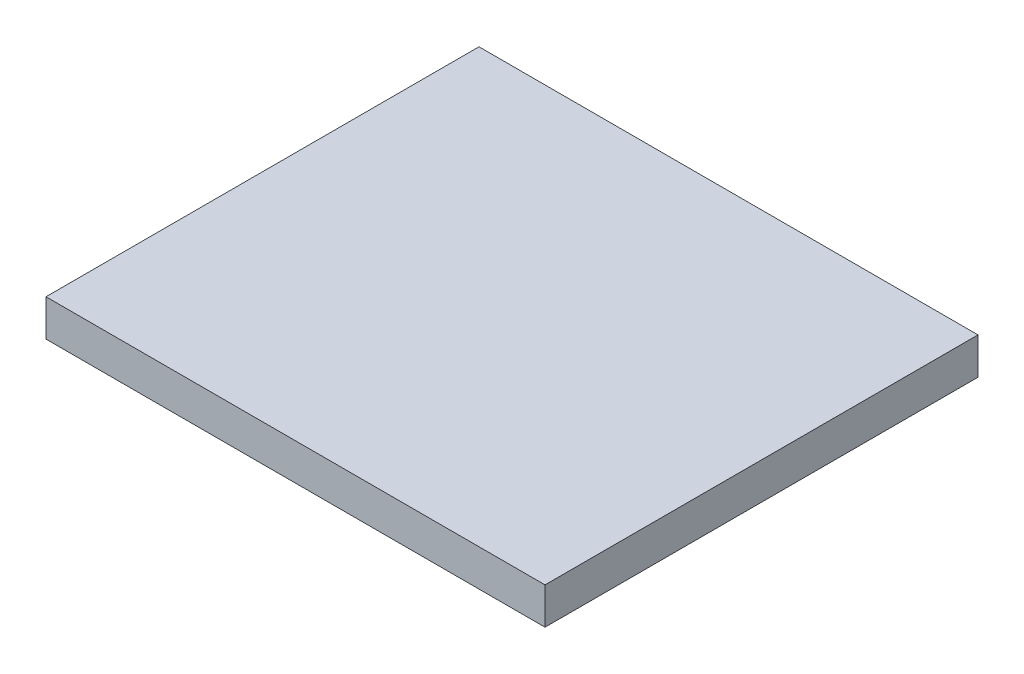
ISO-10303-21;
HEADER;
FILE_DESCRIPTION(('STEP AP214'),'2;1');
FILE_NAME('part.step','',(''),(''),'','','');
FILE_SCHEMA(('AUTOMOTIVE_DESIGN { 1 0 10303 214 1 1 1 1 }'));
ENDSEC;
DATA;
#1=APPLICATION_CONTEXT('core data for automotive mechanical design processes');
#2=APPLICATION_PROTOCOL_DEFINITION('international standard','automotive_design',2000,#1);
#3=PRODUCT_CONTEXT('',#1,'mechanical');
#4=PRODUCT('Part','Part','',(#3));
#5=PRODUCT_RELATED_PRODUCT_CATEGORY('part','',(#4));
#6=PRODUCT_DEFINITION_FORMATION('','',#4);
#7=PRODUCT_DEFINITION_CONTEXT('part definition',#1,'design');
#8=PRODUCT_DEFINITION('design','',#6,#7);
#9=PRODUCT_DEFINITION_SHAPE('','',#8);
#10=(LENGTH_UNIT() NAMED_UNIT(*) SI_UNIT(.MILLI.,.METRE.));
#11=(NAMED_UNIT(*) PLANE_ANGLE_UNIT() SI_UNIT($,.RADIAN.));
#12=(NAMED_UNIT(*) SI_UNIT($,.STERADIAN.) SOLID_ANGLE_UNIT());
#13=UNCERTAINTY_MEASURE_WITH_UNIT(LENGTH_MEASURE(1.E-05),#10,'distance_accuracy_value','');
#14=(GEOMETRIC_REPRESENTATION_CONTEXT(3) GLOBAL_UNCERTAINTY_ASSIGNED_CONTEXT((#13)) GLOBAL_UNIT_ASSIGNED_CONTEXT((#10,
#11,#12)) REPRESENTATION_CONTEXT('',''));
#15=CARTESIAN_POINT('',(0.,0.,0.));
#16=DIRECTION('',(0.,0.,1.));
#17=DIRECTION('',(1.,0.,0.));
#18=AXIS2_PLACEMENT_3D('',#15,#16,#17);
#19=CARTESIAN_POINT('',(-34.,5.,-29.5));
#20=DIRECTION('',(1.,0.,0.));
#21=DIRECTION('',(0.,0.,-1.));
#22=AXIS2_PLACEMENT_3D('',#19,#20,#21);
#23=PLANE('',#22);
#24=DIRECTION('',(0.,0.,1.));
#25=VECTOR('',#24,1.);
#26=CARTESIAN_POINT('',(-34.,0.,-29.5));
#27=LINE('',#26,#25);
#28=CARTESIAN_POINT('',(-34.,0.,-29.5));
#29=VERTEX_POINT('',#28);
#30=CARTESIAN_POINT('',(-34.,0.,29.5));
#31=VERTEX_POINT('',#30);
#32=EDGE_CURVE('E96',#29,#31,#27,.T.);
#33=ORIENTED_EDGE('',*,*,#32,.T.);
#34=DIRECTION('',(0.,-1.,0.));
#35=VECTOR('',#34,1.);
#36=CARTESIAN_POINT('',(-34.,5.,29.5));
#37=LINE('',#36,#35);
#38=CARTESIAN_POINT('',(-34.,5.,29.5));
#39=VERTEX_POINT('',#38);
#40=EDGE_CURVE('E11',#39,#31,#37,.T.);
#41=ORIENTED_EDGE('',*,*,#40,.F.);
#42=DIRECTION('',(0.,0.,1.));
#43=VECTOR('',#42,1.);
#44=CARTESIAN_POINT('',(-34.,5.,-29.5));
#45=LINE('',#44,#43);
#46=CARTESIAN_POINT('',(-34.,5.,-29.5));
#47=VERTEX_POINT('',#46);
#48=EDGE_CURVE('E84',#47,#39,#45,.T.);
#49=ORIENTED_EDGE('',*,*,#48,.F.);
#50=DIRECTION('',(0.,-1.,0.));
#51=VECTOR('',#50,1.);
#52=CARTESIAN_POINT('',(-34.,5.,-29.5));
#53=LINE('',#52,#51);
#54=EDGE_CURVE('E92',#47,#29,#53,.T.);
#55=ORIENTED_EDGE('',*,*,#54,.T.);
#56=EDGE_LOOP('',(#33,#41,#49,#55));
#57=FACE_BOUND('',#56,.T.);
#58=ADVANCED_FACE('F33',(#57),#23,.F.);
#59=CARTESIAN_POINT('',(-34.,5.,29.5));
#60=DIRECTION('',(0.,0.,-1.));
#61=DIRECTION('',(-1.,0.,0.));
#62=AXIS2_PLACEMENT_3D('',#59,#60,#61);
#63=PLANE('',#62);
#64=DIRECTION('',(1.,0.,0.));
#65=VECTOR('',#64,1.);
#66=CARTESIAN_POINT('',(-34.,0.,29.5));
#67=LINE('',#66,#65);
#68=CARTESIAN_POINT('',(34.,0.,29.5));
#69=VERTEX_POINT('',#68);
#70=EDGE_CURVE('E88',#31,#69,#67,.T.);
#71=ORIENTED_EDGE('',*,*,#70,.T.);
#72=DIRECTION('',(0.,-1.,0.));
#73=VECTOR('',#72,1.);
#74=CARTESIAN_POINT('',(34.,5.,29.5));
#75=LINE('',#74,#73);
#76=CARTESIAN_POINT('',(34.,5.,29.5));
#77=VERTEX_POINT('',#76);
#78=EDGE_CURVE('E41',#77,#69,#75,.T.);
#79=ORIENTED_EDGE('',*,*,#78,.F.);
#80=DIRECTION('',(1.,0.,0.));
#81=VECTOR('',#80,1.);
#82=CARTESIAN_POINT('',(-34.,5.,29.5));
#83=LINE('',#82,#81);
#84=EDGE_CURVE('E79',#39,#77,#83,.T.);
#85=ORIENTED_EDGE('',*,*,#84,.F.);
#86=ORIENTED_EDGE('',*,*,#40,.T.);
#87=EDGE_LOOP('',(#71,#79,#85,#86));
#88=FACE_BOUND('',#87,.T.);
#89=ADVANCED_FACE('F87',(#88),#63,.F.);
#90=CARTESIAN_POINT('',(34.,5.,-29.5));
#91=DIRECTION('',(-1.,0.,0.));
#92=DIRECTION('',(0.,0.,1.));
#93=AXIS2_PLACEMENT_3D('',#90,#91,#92);
#94=PLANE('',#93);
#95=DIRECTION('',(0.,0.,-1.));
#96=VECTOR('',#95,1.);
#97=CARTESIAN_POINT('',(34.,0.,-29.5));
#98=LINE('',#97,#96);
#99=CARTESIAN_POINT('',(34.,0.,-29.5));
#100=VERTEX_POINT('',#99);
#101=EDGE_CURVE('E66',#69,#100,#98,.T.);
#102=ORIENTED_EDGE('',*,*,#101,.T.);
#103=DIRECTION('',(0.,-1.,0.));
#104=VECTOR('',#103,1.);
#105=CARTESIAN_POINT('',(34.,5.,-29.5));
#106=LINE('',#105,#104);
#107=CARTESIAN_POINT('',(34.,5.,-29.5));
#108=VERTEX_POINT('',#107);
#109=EDGE_CURVE('E89',#108,#100,#106,.T.);
#110=ORIENTED_EDGE('',*,*,#109,.F.);
#111=DIRECTION('',(0.,0.,-1.));
#112=VECTOR('',#111,1.);
#113=CARTESIAN_POINT('',(34.,5.,-29.5));
#114=LINE('',#113,#112);
#115=EDGE_CURVE('E82',#77,#108,#114,.T.);
#116=ORIENTED_EDGE('',*,*,#115,.F.);
#117=ORIENTED_EDGE('',*,*,#78,.T.);
#118=EDGE_LOOP('',(#102,#110,#116,#117));
#119=FACE_BOUND('',#118,.T.);
#120=ADVANCED_FACE('F90',(#119),#94,.F.);
#121=CARTESIAN_POINT('',(-34.,5.,-29.5));
#122=DIRECTION('',(0.,0.,1.));
#123=DIRECTION('',(1.,0.,0.));
#124=AXIS2_PLACEMENT_3D('',#121,#122,#123);
#125=PLANE('',#124);
#126=DIRECTION('',(-1.,0.,0.));
#127=VECTOR('',#126,1.);
#128=CARTESIAN_POINT('',(-34.,0.,-29.5));
#129=LINE('',#128,#127);
#130=EDGE_CURVE('E72',#100,#29,#129,.T.);
#131=ORIENTED_EDGE('',*,*,#130,.T.);
#132=ORIENTED_EDGE('',*,*,#54,.F.);
#133=DIRECTION('',(-1.,0.,0.));
#134=VECTOR('',#133,1.);
#135=CARTESIAN_POINT('',(-34.,5.,-29.5));
#136=LINE('',#135,#134);
#137=EDGE_CURVE('E49',#108,#47,#136,.T.);
#138=ORIENTED_EDGE('',*,*,#137,.F.);
#139=ORIENTED_EDGE('',*,*,#109,.T.);
#140=EDGE_LOOP('',(#131,#132,#138,#139));
#141=FACE_BOUND('',#140,.T.);
#142=ADVANCED_FACE('F103',(#141),#125,.F.);
#143=CARTESIAN_POINT('',(0.,5.,0.));
#144=DIRECTION('',(0.,1.,0.));
#145=DIRECTION('',(0.,0.,1.));
#146=AXIS2_PLACEMENT_3D('',#143,#144,#145);
#147=PLANE('',#146);
#148=ORIENTED_EDGE('',*,*,#48,.T.);
#149=ORIENTED_EDGE('',*,*,#84,.T.);
#150=ORIENTED_EDGE('',*,*,#115,.T.);
#151=ORIENTED_EDGE('',*,*,#137,.T.);
#152=EDGE_LOOP('',(#148,#149,#150,#151));
#153=FACE_BOUND('',#152,.T.);
#154=ADVANCED_FACE('F80',(#153),#147,.T.);
#155=CARTESIAN_POINT('',(0.,0.,0.));
#156=DIRECTION('',(0.,1.,0.));
#157=DIRECTION('',(0.,0.,1.));
#158=AXIS2_PLACEMENT_3D('',#155,#156,#157);
#159=PLANE('',#158);
#160=ORIENTED_EDGE('',*,*,#32,.F.);
#161=ORIENTED_EDGE('',*,*,#130,.F.);
#162=ORIENTED_EDGE('',*,*,#101,.F.);
#163=ORIENTED_EDGE('',*,*,#70,.F.);
#164=EDGE_LOOP('',(#160,#161,#162,#163));
#165=FACE_BOUND('',#164,.T.);
#166=ADVANCED_FACE('F106',(#165),#159,.F.);
#167=CLOSED_SHELL('',(#58,#89,#120,#142,#154,#166));
#168=MANIFOLD_SOLID_BREP('B2',#167);
#169=ADVANCED_BREP_SHAPE_REPRESENTATION('',(#18,#168),#14);
#170=SHAPE_DEFINITION_REPRESENTATION(#9,#169);
ENDSEC;
END-ISO-10303-21;
